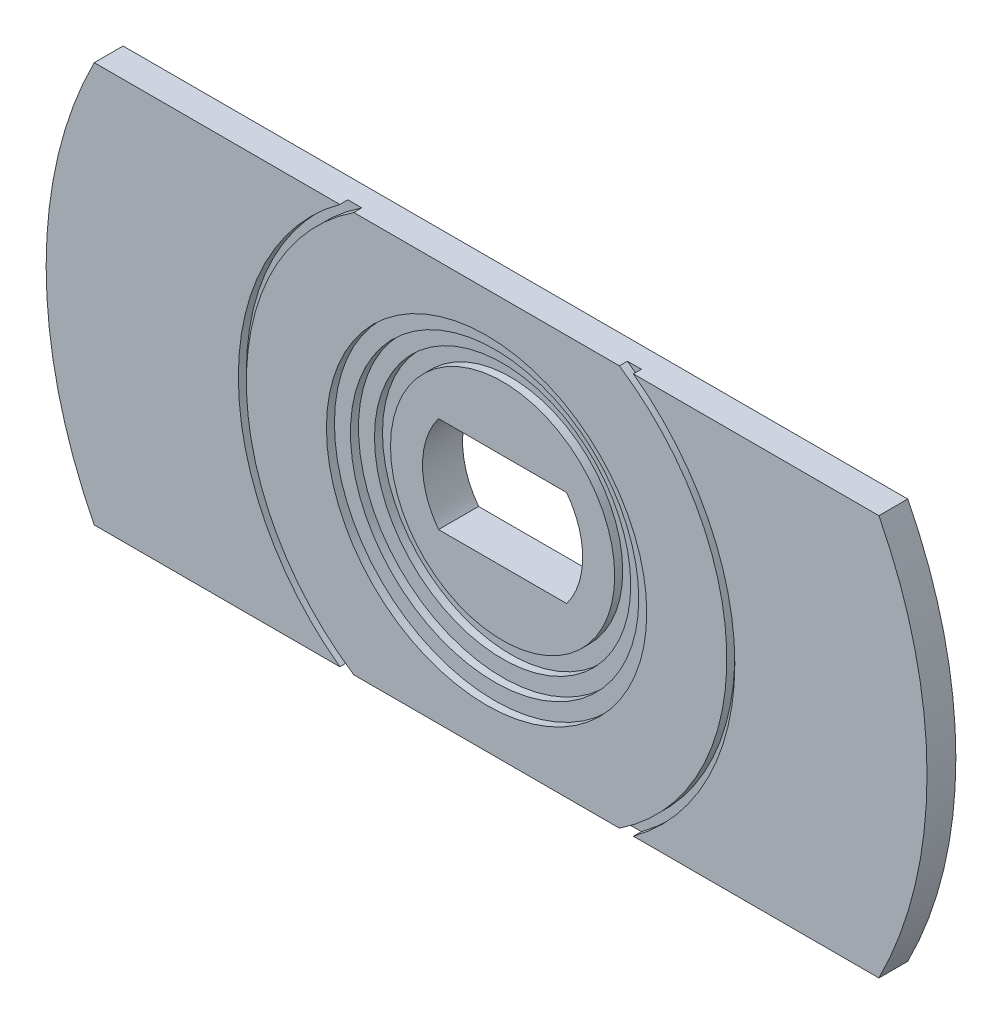
ISO-10303-21;
HEADER;
FILE_DESCRIPTION(('STEP AP214'),'2;1');
FILE_NAME('part.step','',(''),(''),'','','');
FILE_SCHEMA(('AUTOMOTIVE_DESIGN { 1 0 10303 214 1 1 1 1 }'));
ENDSEC;
DATA;
#1=APPLICATION_CONTEXT('core data for automotive mechanical design processes');
#2=APPLICATION_PROTOCOL_DEFINITION('international standard','automotive_design',2000,#1);
#3=PRODUCT_CONTEXT('',#1,'mechanical');
#4=PRODUCT('Part','Part','',(#3));
#5=PRODUCT_RELATED_PRODUCT_CATEGORY('part','',(#4));
#6=PRODUCT_DEFINITION_FORMATION('','',#4);
#7=PRODUCT_DEFINITION_CONTEXT('part definition',#1,'design');
#8=PRODUCT_DEFINITION('design','',#6,#7);
#9=PRODUCT_DEFINITION_SHAPE('','',#8);
#10=(LENGTH_UNIT() NAMED_UNIT(*) SI_UNIT(.MILLI.,.METRE.));
#11=(NAMED_UNIT(*) PLANE_ANGLE_UNIT() SI_UNIT($,.RADIAN.));
#12=(NAMED_UNIT(*) SI_UNIT($,.STERADIAN.) SOLID_ANGLE_UNIT());
#13=UNCERTAINTY_MEASURE_WITH_UNIT(LENGTH_MEASURE(1.E-05),#10,'distance_accuracy_value','');
#14=(GEOMETRIC_REPRESENTATION_CONTEXT(3) GLOBAL_UNCERTAINTY_ASSIGNED_CONTEXT((#13)) GLOBAL_UNIT_ASSIGNED_CONTEXT((#10,
#11,#12)) REPRESENTATION_CONTEXT('',''));
#15=CARTESIAN_POINT('',(0.,0.,0.));
#16=DIRECTION('',(0.,0.,1.));
#17=DIRECTION('',(1.,0.,0.));
#18=AXIS2_PLACEMENT_3D('',#15,#16,#17);
#19=CARTESIAN_POINT('',(0.,0.,1.48351648351648));
#20=DIRECTION('',(0.,0.,1.));
#21=DIRECTION('',(1.,0.,0.));
#22=AXIS2_PLACEMENT_3D('',#19,#20,#21);
#23=CYLINDRICAL_SURFACE('',#22,15.);
#24=CARTESIAN_POINT('',(0.,0.,-0.500000000000002));
#25=DIRECTION('',(0.,0.,1.));
#26=DIRECTION('',(1.,0.,0.));
#27=AXIS2_PLACEMENT_3D('',#24,#25,#26);
#28=CIRCLE('',#27,15.);
#29=CARTESIAN_POINT('',(8.2915619758885,-12.5,-0.500000000000002));
#30=VERTEX_POINT('',#29);
#31=CARTESIAN_POINT('',(8.2915619758885,12.5,-0.500000000000002));
#32=VERTEX_POINT('',#31);
#33=EDGE_CURVE('E266',#30,#32,#28,.T.);
#34=ORIENTED_EDGE('',*,*,#33,.T.);
#35=DIRECTION('',(0.,0.,1.));
#36=VECTOR('',#35,1.);
#37=CARTESIAN_POINT('',(8.2915619758885,12.5,1.48351648351648));
#38=LINE('',#37,#36);
#39=CARTESIAN_POINT('',(8.2915619758885,12.5,0.));
#40=VERTEX_POINT('',#39);
#41=EDGE_CURVE('E247',#32,#40,#38,.T.);
#42=ORIENTED_EDGE('',*,*,#41,.T.);
#43=CARTESIAN_POINT('',(0.,0.,0.));
#44=DIRECTION('',(0.,0.,1.));
#45=DIRECTION('',(1.,0.,0.));
#46=AXIS2_PLACEMENT_3D('',#43,#44,#45);
#47=CIRCLE('',#46,15.);
#48=CARTESIAN_POINT('',(8.2915619758885,-12.5,0.));
#49=VERTEX_POINT('',#48);
#50=EDGE_CURVE('E270',#49,#40,#47,.T.);
#51=ORIENTED_EDGE('',*,*,#50,.F.);
#52=DIRECTION('',(0.,0.,1.));
#53=VECTOR('',#52,1.);
#54=CARTESIAN_POINT('',(8.2915619758885,-12.5,1.48351648351648));
#55=LINE('',#54,#53);
#56=EDGE_CURVE('E224',#49,#30,#55,.F.);
#57=ORIENTED_EDGE('',*,*,#56,.T.);
#58=EDGE_LOOP('',(#34,#42,#51,#57));
#59=FACE_BOUND('',#58,.T.);
#60=ADVANCED_FACE('F35',(#59),#23,.T.);
#61=CARTESIAN_POINT('',(0.,15.,-0.500000000000002));
#62=DIRECTION('',(0.,0.,-1.));
#63=DIRECTION('',(-1.,0.,0.));
#64=AXIS2_PLACEMENT_3D('',#61,#62,#63);
#65=PLANE('',#64);
#66=CARTESIAN_POINT('',(0.,0.,-0.500000000000002));
#67=DIRECTION('',(0.,0.,1.));
#68=DIRECTION('',(1.,0.,0.));
#69=AXIS2_PLACEMENT_3D('',#66,#67,#68);
#70=CIRCLE('',#69,15.5);
#71=CARTESIAN_POINT('',(9.16515138991168,-12.5,-0.500000000000002));
#72=VERTEX_POINT('',#71);
#73=CARTESIAN_POINT('',(9.16515138991168,12.5,-0.500000000000002));
#74=VERTEX_POINT('',#73);
#75=EDGE_CURVE('E262',#72,#74,#70,.T.);
#76=ORIENTED_EDGE('',*,*,#75,.T.);
#77=DIRECTION('',(-1.,0.,0.));
#78=VECTOR('',#77,1.);
#79=CARTESIAN_POINT('',(0.,12.5,-0.500000000000002));
#80=LINE('',#79,#78);
#81=EDGE_CURVE('E241',#74,#32,#80,.T.);
#82=ORIENTED_EDGE('',*,*,#81,.T.);
#83=ORIENTED_EDGE('',*,*,#33,.F.);
#84=DIRECTION('',(1.,0.,0.));
#85=VECTOR('',#84,1.);
#86=CARTESIAN_POINT('',(0.,-12.5,-0.500000000000002));
#87=LINE('',#86,#85);
#88=EDGE_CURVE('E221',#30,#72,#87,.T.);
#89=ORIENTED_EDGE('',*,*,#88,.T.);
#90=EDGE_LOOP('',(#76,#82,#83,#89));
#91=FACE_BOUND('',#90,.T.);
#92=ADVANCED_FACE('F336',(#91),#65,.F.);
#93=CARTESIAN_POINT('',(0.,0.,1.48351648351648));
#94=DIRECTION('',(0.,0.,1.));
#95=DIRECTION('',(1.,0.,0.));
#96=AXIS2_PLACEMENT_3D('',#93,#94,#95);
#97=CYLINDRICAL_SURFACE('',#96,15.5);
#98=CARTESIAN_POINT('',(0.,0.,0.));
#99=DIRECTION('',(0.,0.,1.));
#100=DIRECTION('',(1.,0.,0.));
#101=AXIS2_PLACEMENT_3D('',#98,#99,#100);
#102=CIRCLE('',#101,15.5);
#103=CARTESIAN_POINT('',(9.16515138991165,-12.5,0.));
#104=VERTEX_POINT('',#103);
#105=CARTESIAN_POINT('',(9.16515138991166,12.5,0.));
#106=VERTEX_POINT('',#105);
#107=EDGE_CURVE('E258',#104,#106,#102,.T.);
#108=ORIENTED_EDGE('',*,*,#107,.T.);
#109=DIRECTION('',(0.,0.,1.));
#110=VECTOR('',#109,1.);
#111=CARTESIAN_POINT('',(9.16515138991168,12.5,1.48351648351648));
#112=LINE('',#111,#110);
#113=EDGE_CURVE('E244',#106,#74,#112,.F.);
#114=ORIENTED_EDGE('',*,*,#113,.T.);
#115=ORIENTED_EDGE('',*,*,#75,.F.);
#116=DIRECTION('',(0.,0.,1.));
#117=VECTOR('',#116,1.);
#118=CARTESIAN_POINT('',(9.16515138991168,-12.5,1.48351648351648));
#119=LINE('',#118,#117);
#120=EDGE_CURVE('E210',#72,#104,#119,.T.);
#121=ORIENTED_EDGE('',*,*,#120,.T.);
#122=EDGE_LOOP('',(#108,#114,#115,#121));
#123=FACE_BOUND('',#122,.T.);
#124=ADVANCED_FACE('F339',(#123),#97,.F.);
#125=CARTESIAN_POINT('',(0.,27.5,0.));
#126=DIRECTION('',(0.,0.,-1.));
#127=DIRECTION('',(-1.,0.,0.));
#128=AXIS2_PLACEMENT_3D('',#125,#126,#127);
#129=PLANE('',#128);
#130=CARTESIAN_POINT('',(0.,0.,0.));
#131=DIRECTION('',(0.,0.,1.));
#132=DIRECTION('',(1.,0.,0.));
#133=AXIS2_PLACEMENT_3D('',#130,#131,#132);
#134=CIRCLE('',#133,27.5);
#135=CARTESIAN_POINT('',(24.4948974278318,-12.5,0.));
#136=VERTEX_POINT('',#135);
#137=CARTESIAN_POINT('',(24.4948974278318,12.5,0.));
#138=VERTEX_POINT('',#137);
#139=EDGE_CURVE('E254',#136,#138,#134,.T.);
#140=ORIENTED_EDGE('',*,*,#139,.T.);
#141=DIRECTION('',(1.,0.,0.));
#142=VECTOR('',#141,1.);
#143=CARTESIAN_POINT('',(-24.4948974278318,12.5,0.));
#144=LINE('',#143,#142);
#145=EDGE_CURVE('E205',#106,#138,#144,.T.);
#146=ORIENTED_EDGE('',*,*,#145,.F.);
#147=ORIENTED_EDGE('',*,*,#107,.F.);
#148=DIRECTION('',(-1.,0.,0.));
#149=VECTOR('',#148,1.);
#150=CARTESIAN_POINT('',(-24.4948974278318,-12.5,0.));
#151=LINE('',#150,#149);
#152=EDGE_CURVE('E211',#136,#104,#151,.T.);
#153=ORIENTED_EDGE('',*,*,#152,.F.);
#154=EDGE_LOOP('',(#140,#146,#147,#153));
#155=FACE_BOUND('',#154,.T.);
#156=ADVANCED_FACE('F343',(#155),#129,.F.);
#157=CARTESIAN_POINT('',(0.,0.,1.48351648351648));
#158=DIRECTION('',(0.,0.,1.));
#159=DIRECTION('',(1.,0.,0.));
#160=AXIS2_PLACEMENT_3D('',#157,#158,#159);
#161=CYLINDRICAL_SURFACE('',#160,27.5);
#162=CARTESIAN_POINT('',(0.,0.,-1.8));
#163=DIRECTION('',(0.,0.,1.));
#164=DIRECTION('',(1.,0.,0.));
#165=AXIS2_PLACEMENT_3D('',#162,#163,#164);
#166=CIRCLE('',#165,27.5);
#167=CARTESIAN_POINT('',(24.4948974278318,-12.5,-1.8));
#168=VERTEX_POINT('',#167);
#169=CARTESIAN_POINT('',(24.4948974278318,12.5,-1.8));
#170=VERTEX_POINT('',#169);
#171=EDGE_CURVE('E250',#168,#170,#166,.T.);
#172=ORIENTED_EDGE('',*,*,#171,.T.);
#173=DIRECTION('',(0.,0.,1.));
#174=VECTOR('',#173,1.);
#175=CARTESIAN_POINT('',(24.4948974278318,12.5,-53.034753829798));
#176=LINE('',#175,#174);
#177=EDGE_CURVE('E58',#170,#138,#176,.T.);
#178=ORIENTED_EDGE('',*,*,#177,.T.);
#179=ORIENTED_EDGE('',*,*,#139,.F.);
#180=DIRECTION('',(0.,0.,1.));
#181=VECTOR('',#180,1.);
#182=CARTESIAN_POINT('',(24.4948974278318,-12.5,-53.034753829798));
#183=LINE('',#182,#181);
#184=EDGE_CURVE('E213',#168,#136,#183,.T.);
#185=ORIENTED_EDGE('',*,*,#184,.F.);
#186=EDGE_LOOP('',(#172,#178,#179,#185));
#187=FACE_BOUND('',#186,.T.);
#188=ADVANCED_FACE('F348',(#187),#161,.T.);
#189=CARTESIAN_POINT('',(0.,7.,-1.5));
#190=DIRECTION('',(0.,0.,-1.));
#191=DIRECTION('',(-1.,0.,0.));
#192=AXIS2_PLACEMENT_3D('',#189,#190,#191);
#193=PLANE('',#192);
#194=CARTESIAN_POINT('',(0.,0.,-1.5));
#195=DIRECTION('',(0.,0.,1.));
#196=DIRECTION('',(1.,0.,0.));
#197=AXIS2_PLACEMENT_3D('',#194,#195,#196);
#198=CIRCLE('',#197,7.);
#199=CARTESIAN_POINT('',(7.,0.,-1.5));
#200=VERTEX_POINT('',#199);
#201=EDGE_CURVE('E11',#200,#200,#198,.T.);
#202=ORIENTED_EDGE('',*,*,#201,.F.);
#203=EDGE_LOOP('',(#202));
#204=FACE_BOUND('',#203,.T.);
#205=CARTESIAN_POINT('',(0.,0.,-1.5));
#206=DIRECTION('',(0.,0.,1.));
#207=DIRECTION('',(1.,0.,0.));
#208=AXIS2_PLACEMENT_3D('',#205,#206,#207);
#209=CIRCLE('',#208,8.);
#210=CARTESIAN_POINT('',(8.,0.,-1.5));
#211=VERTEX_POINT('',#210);
#212=EDGE_CURVE('E43',#211,#211,#209,.T.);
#213=ORIENTED_EDGE('',*,*,#212,.T.);
#214=EDGE_LOOP('',(#213));
#215=FACE_BOUND('',#214,.T.);
#216=ADVANCED_FACE('F37',(#204,#215),#193,.F.);
#217=CARTESIAN_POINT('',(0.,0.,1.48351648351648));
#218=DIRECTION('',(0.,0.,1.));
#219=DIRECTION('',(1.,0.,0.));
#220=AXIS2_PLACEMENT_3D('',#217,#218,#219);
#221=CYLINDRICAL_SURFACE('',#220,8.);
#222=ORIENTED_EDGE('',*,*,#212,.F.);
#223=EDGE_LOOP('',(#222));
#224=FACE_BOUND('',#223,.T.);
#225=CARTESIAN_POINT('',(0.,0.,-1.));
#226=DIRECTION('',(0.,0.,1.));
#227=DIRECTION('',(1.,0.,0.));
#228=AXIS2_PLACEMENT_3D('',#225,#226,#227);
#229=CIRCLE('',#228,8.);
#230=CARTESIAN_POINT('',(8.,0.,-1.));
#231=VERTEX_POINT('',#230);
#232=EDGE_CURVE('E286',#231,#231,#229,.T.);
#233=ORIENTED_EDGE('',*,*,#232,.T.);
#234=EDGE_LOOP('',(#233));
#235=FACE_BOUND('',#234,.T.);
#236=ADVANCED_FACE('F292',(#224,#235),#221,.F.);
#237=CARTESIAN_POINT('',(0.,8.,-1.));
#238=DIRECTION('',(0.,0.,-1.));
#239=DIRECTION('',(-1.,0.,0.));
#240=AXIS2_PLACEMENT_3D('',#237,#238,#239);
#241=PLANE('',#240);
#242=ORIENTED_EDGE('',*,*,#232,.F.);
#243=EDGE_LOOP('',(#242));
#244=FACE_BOUND('',#243,.T.);
#245=CARTESIAN_POINT('',(0.,0.,-1.));
#246=DIRECTION('',(0.,0.,1.));
#247=DIRECTION('',(1.,0.,0.));
#248=AXIS2_PLACEMENT_3D('',#245,#246,#247);
#249=CIRCLE('',#248,9.);
#250=CARTESIAN_POINT('',(9.,0.,-1.));
#251=VERTEX_POINT('',#250);
#252=EDGE_CURVE('E283',#251,#251,#249,.T.);
#253=ORIENTED_EDGE('',*,*,#252,.T.);
#254=EDGE_LOOP('',(#253));
#255=FACE_BOUND('',#254,.T.);
#256=ADVANCED_FACE('F295',(#244,#255),#241,.F.);
#257=CARTESIAN_POINT('',(0.,0.,1.48351648351648));
#258=DIRECTION('',(0.,0.,1.));
#259=DIRECTION('',(1.,0.,0.));
#260=AXIS2_PLACEMENT_3D('',#257,#258,#259);
#261=CYLINDRICAL_SURFACE('',#260,9.);
#262=ORIENTED_EDGE('',*,*,#252,.F.);
#263=EDGE_LOOP('',(#262));
#264=FACE_BOUND('',#263,.T.);
#265=CARTESIAN_POINT('',(0.,0.,-0.500000000000003));
#266=DIRECTION('',(0.,0.,1.));
#267=DIRECTION('',(1.,0.,0.));
#268=AXIS2_PLACEMENT_3D('',#265,#266,#267);
#269=CIRCLE('',#268,9.);
#270=CARTESIAN_POINT('',(9.,0.,-0.500000000000003));
#271=VERTEX_POINT('',#270);
#272=EDGE_CURVE('E280',#271,#271,#269,.T.);
#273=ORIENTED_EDGE('',*,*,#272,.T.);
#274=EDGE_LOOP('',(#273));
#275=FACE_BOUND('',#274,.T.);
#276=ADVANCED_FACE('F300',(#264,#275),#261,.F.);
#277=CARTESIAN_POINT('',(0.,9.,-0.500000000000003));
#278=DIRECTION('',(0.,0.,-1.));
#279=DIRECTION('',(-1.,0.,0.));
#280=AXIS2_PLACEMENT_3D('',#277,#278,#279);
#281=PLANE('',#280);
#282=ORIENTED_EDGE('',*,*,#272,.F.);
#283=EDGE_LOOP('',(#282));
#284=FACE_BOUND('',#283,.T.);
#285=CARTESIAN_POINT('',(0.,0.,-0.500000000000003));
#286=DIRECTION('',(0.,0.,1.));
#287=DIRECTION('',(1.,0.,0.));
#288=AXIS2_PLACEMENT_3D('',#285,#286,#287);
#289=CIRCLE('',#288,10.);
#290=CARTESIAN_POINT('',(10.,0.,-0.500000000000003));
#291=VERTEX_POINT('',#290);
#292=EDGE_CURVE('E277',#291,#291,#289,.T.);
#293=ORIENTED_EDGE('',*,*,#292,.T.);
#294=EDGE_LOOP('',(#293));
#295=FACE_BOUND('',#294,.T.);
#296=ADVANCED_FACE('F306',(#284,#295),#281,.F.);
#297=CARTESIAN_POINT('',(0.,0.,1.48351648351648));
#298=DIRECTION('',(0.,0.,1.));
#299=DIRECTION('',(1.,0.,0.));
#300=AXIS2_PLACEMENT_3D('',#297,#298,#299);
#301=CYLINDRICAL_SURFACE('',#300,10.);
#302=ORIENTED_EDGE('',*,*,#292,.F.);
#303=EDGE_LOOP('',(#302));
#304=FACE_BOUND('',#303,.T.);
#305=CARTESIAN_POINT('',(0.,0.,0.));
#306=DIRECTION('',(0.,0.,1.));
#307=DIRECTION('',(1.,0.,0.));
#308=AXIS2_PLACEMENT_3D('',#305,#306,#307);
#309=CIRCLE('',#308,10.);
#310=CARTESIAN_POINT('',(10.,0.,0.));
#311=VERTEX_POINT('',#310);
#312=EDGE_CURVE('E274',#311,#311,#309,.T.);
#313=ORIENTED_EDGE('',*,*,#312,.T.);
#314=EDGE_LOOP('',(#313));
#315=FACE_BOUND('',#314,.T.);
#316=ADVANCED_FACE('F312',(#304,#315),#301,.F.);
#317=CARTESIAN_POINT('',(0.,15.,0.));
#318=DIRECTION('',(0.,0.,-1.));
#319=DIRECTION('',(-1.,0.,0.));
#320=AXIS2_PLACEMENT_3D('',#317,#318,#319);
#321=PLANE('',#320);
#322=ORIENTED_EDGE('',*,*,#312,.F.);
#323=EDGE_LOOP('',(#322));
#324=FACE_BOUND('',#323,.T.);
#325=ORIENTED_EDGE('',*,*,#50,.T.);
#326=CARTESIAN_POINT('',(-8.2915619758885,12.5,0.));
#327=VERTEX_POINT('',#326);
#328=EDGE_CURVE('E204',#327,#40,#144,.T.);
#329=ORIENTED_EDGE('',*,*,#328,.F.);
#330=CARTESIAN_POINT('',(-8.2915619758885,-12.5,0.));
#331=VERTEX_POINT('',#330);
#332=EDGE_CURVE('E273',#327,#331,#47,.T.);
#333=ORIENTED_EDGE('',*,*,#332,.T.);
#334=EDGE_CURVE('E214',#49,#331,#151,.T.);
#335=ORIENTED_EDGE('',*,*,#334,.F.);
#336=EDGE_LOOP('',(#325,#329,#333,#335));
#337=FACE_BOUND('',#336,.T.);
#338=ADVANCED_FACE('F318',(#324,#337),#321,.F.);
#339=ORIENTED_EDGE('',*,*,#332,.F.);
#340=DIRECTION('',(0.,0.,1.));
#341=VECTOR('',#340,1.);
#342=CARTESIAN_POINT('',(-8.2915619758885,12.5,1.48351648351648));
#343=LINE('',#342,#341);
#344=CARTESIAN_POINT('',(-8.2915619758885,12.5,-0.500000000000002));
#345=VERTEX_POINT('',#344);
#346=EDGE_CURVE('E240',#327,#345,#343,.F.);
#347=ORIENTED_EDGE('',*,*,#346,.T.);
#348=CARTESIAN_POINT('',(-8.2915619758885,-12.5,-0.500000000000002));
#349=VERTEX_POINT('',#348);
#350=EDGE_CURVE('E269',#345,#349,#28,.T.);
#351=ORIENTED_EDGE('',*,*,#350,.T.);
#352=DIRECTION('',(0.,0.,1.));
#353=VECTOR('',#352,1.);
#354=CARTESIAN_POINT('',(-8.2915619758885,-12.5,1.48351648351648));
#355=LINE('',#354,#353);
#356=EDGE_CURVE('E231',#349,#331,#355,.T.);
#357=ORIENTED_EDGE('',*,*,#356,.T.);
#358=EDGE_LOOP('',(#339,#347,#351,#357));
#359=FACE_BOUND('',#358,.T.);
#360=ADVANCED_FACE('F324',(#359),#23,.T.);
#361=ORIENTED_EDGE('',*,*,#350,.F.);
#362=CARTESIAN_POINT('',(-9.16515138991168,12.5,-0.500000000000002));
#363=VERTEX_POINT('',#362);
#364=EDGE_CURVE('E237',#345,#363,#80,.T.);
#365=ORIENTED_EDGE('',*,*,#364,.T.);
#366=CARTESIAN_POINT('',(-9.16515138991168,-12.5,-0.500000000000002));
#367=VERTEX_POINT('',#366);
#368=EDGE_CURVE('E265',#363,#367,#70,.T.);
#369=ORIENTED_EDGE('',*,*,#368,.T.);
#370=EDGE_CURVE('E225',#367,#349,#87,.T.);
#371=ORIENTED_EDGE('',*,*,#370,.T.);
#372=EDGE_LOOP('',(#361,#365,#369,#371));
#373=FACE_BOUND('',#372,.T.);
#374=ADVANCED_FACE('F373',(#373),#65,.F.);
#375=ORIENTED_EDGE('',*,*,#368,.F.);
#376=DIRECTION('',(0.,0.,1.));
#377=VECTOR('',#376,1.);
#378=CARTESIAN_POINT('',(-9.16515138991168,12.5,1.48351648351648));
#379=LINE('',#378,#377);
#380=CARTESIAN_POINT('',(-9.16515138991168,12.5,0.));
#381=VERTEX_POINT('',#380);
#382=EDGE_CURVE('E234',#363,#381,#379,.T.);
#383=ORIENTED_EDGE('',*,*,#382,.T.);
#384=CARTESIAN_POINT('',(-9.16515138991168,-12.5,0.));
#385=VERTEX_POINT('',#384);
#386=EDGE_CURVE('E261',#381,#385,#102,.T.);
#387=ORIENTED_EDGE('',*,*,#386,.T.);
#388=DIRECTION('',(0.,0.,1.));
#389=VECTOR('',#388,1.);
#390=CARTESIAN_POINT('',(-9.16515138991168,-12.5,1.48351648351648));
#391=LINE('',#390,#389);
#392=EDGE_CURVE('E228',#385,#367,#391,.F.);
#393=ORIENTED_EDGE('',*,*,#392,.T.);
#394=EDGE_LOOP('',(#375,#383,#387,#393));
#395=FACE_BOUND('',#394,.T.);
#396=ADVANCED_FACE('F368',(#395),#97,.F.);
#397=ORIENTED_EDGE('',*,*,#386,.F.);
#398=CARTESIAN_POINT('',(-24.4948974278318,12.5,0.));
#399=VERTEX_POINT('',#398);
#400=EDGE_CURVE('E201',#399,#381,#144,.T.);
#401=ORIENTED_EDGE('',*,*,#400,.F.);
#402=CARTESIAN_POINT('',(-24.4948974278318,-12.5,0.));
#403=VERTEX_POINT('',#402);
#404=EDGE_CURVE('E257',#399,#403,#134,.T.);
#405=ORIENTED_EDGE('',*,*,#404,.T.);
#406=EDGE_CURVE('E200',#385,#403,#151,.T.);
#407=ORIENTED_EDGE('',*,*,#406,.F.);
#408=EDGE_LOOP('',(#397,#401,#405,#407));
#409=FACE_BOUND('',#408,.T.);
#410=ADVANCED_FACE('F364',(#409),#129,.F.);
#411=ORIENTED_EDGE('',*,*,#404,.F.);
#412=DIRECTION('',(0.,0.,1.));
#413=VECTOR('',#412,1.);
#414=CARTESIAN_POINT('',(-24.4948974278318,12.5,-53.034753829798));
#415=LINE('',#414,#413);
#416=CARTESIAN_POINT('',(-24.4948974278318,12.5,-1.8));
#417=VERTEX_POINT('',#416);
#418=EDGE_CURVE('E203',#417,#399,#415,.T.);
#419=ORIENTED_EDGE('',*,*,#418,.F.);
#420=CARTESIAN_POINT('',(-24.4948974278318,-12.5,-1.8));
#421=VERTEX_POINT('',#420);
#422=EDGE_CURVE('E253',#417,#421,#166,.T.);
#423=ORIENTED_EDGE('',*,*,#422,.T.);
#424=DIRECTION('',(0.,0.,1.));
#425=VECTOR('',#424,1.);
#426=CARTESIAN_POINT('',(-24.4948974278318,-12.5,-53.034753829798));
#427=LINE('',#426,#425);
#428=EDGE_CURVE('E50',#421,#403,#427,.T.);
#429=ORIENTED_EDGE('',*,*,#428,.T.);
#430=EDGE_LOOP('',(#411,#419,#423,#429));
#431=FACE_BOUND('',#430,.T.);
#432=ADVANCED_FACE('F359',(#431),#161,.T.);
#433=CARTESIAN_POINT('',(0.,27.5,-1.8));
#434=DIRECTION('',(0.,0.,1.));
#435=DIRECTION('',(1.,0.,0.));
#436=AXIS2_PLACEMENT_3D('',#433,#434,#435);
#437=PLANE('',#436);
#438=ORIENTED_EDGE('',*,*,#422,.F.);
#439=DIRECTION('',(-1.,0.,0.));
#440=VECTOR('',#439,1.);
#441=CARTESIAN_POINT('',(-24.4948974278318,12.5,-1.8));
#442=LINE('',#441,#440);
#443=EDGE_CURVE('E207',#170,#417,#442,.T.);
#444=ORIENTED_EDGE('',*,*,#443,.F.);
#445=ORIENTED_EDGE('',*,*,#171,.F.);
#446=DIRECTION('',(1.,0.,0.));
#447=VECTOR('',#446,1.);
#448=CARTESIAN_POINT('',(-24.4948974278318,-12.5,-1.8));
#449=LINE('',#448,#447);
#450=EDGE_CURVE('E216',#421,#168,#449,.T.);
#451=ORIENTED_EDGE('',*,*,#450,.F.);
#452=EDGE_LOOP('',(#438,#444,#445,#451));
#453=FACE_BOUND('',#452,.T.);
#454=CARTESIAN_POINT('',(0.,0.,-1.8));
#455=DIRECTION('',(0.,0.,1.));
#456=DIRECTION('',(1.,0.,0.));
#457=AXIS2_PLACEMENT_3D('',#454,#455,#456);
#458=CIRCLE('',#457,7.);
#459=CARTESIAN_POINT('',(7.,0.,-1.8));
#460=VERTEX_POINT('',#459);
#461=EDGE_CURVE('E197',#460,#460,#458,.F.);
#462=ORIENTED_EDGE('',*,*,#461,.F.);
#463=EDGE_LOOP('',(#462));
#464=FACE_BOUND('',#463,.T.);
#465=ADVANCED_FACE('F352',(#453,#464),#437,.F.);
#466=CARTESIAN_POINT('',(-24.4948974278318,-12.5,-53.034753829798));
#467=DIRECTION('',(0.,1.,0.));
#468=DIRECTION('',(0.,0.,1.));
#469=AXIS2_PLACEMENT_3D('',#466,#467,#468);
#470=PLANE('',#469);
#471=ORIENTED_EDGE('',*,*,#370,.F.);
#472=ORIENTED_EDGE('',*,*,#392,.F.);
#473=ORIENTED_EDGE('',*,*,#406,.T.);
#474=ORIENTED_EDGE('',*,*,#428,.F.);
#475=ORIENTED_EDGE('',*,*,#450,.T.);
#476=ORIENTED_EDGE('',*,*,#184,.T.);
#477=ORIENTED_EDGE('',*,*,#152,.T.);
#478=ORIENTED_EDGE('',*,*,#120,.F.);
#479=ORIENTED_EDGE('',*,*,#88,.F.);
#480=ORIENTED_EDGE('',*,*,#56,.F.);
#481=ORIENTED_EDGE('',*,*,#334,.T.);
#482=ORIENTED_EDGE('',*,*,#356,.F.);
#483=EDGE_LOOP('',(#471,#472,#473,#474,#475,#476,#477,#478,#479,#480,#481,#482));
#484=FACE_BOUND('',#483,.T.);
#485=ADVANCED_FACE('F376',(#484),#470,.F.);
#486=CARTESIAN_POINT('',(-24.4948974278318,12.5,-53.034753829798));
#487=DIRECTION('',(0.,-1.,0.));
#488=DIRECTION('',(0.,0.,-1.));
#489=AXIS2_PLACEMENT_3D('',#486,#487,#488);
#490=PLANE('',#489);
#491=ORIENTED_EDGE('',*,*,#81,.F.);
#492=ORIENTED_EDGE('',*,*,#113,.F.);
#493=ORIENTED_EDGE('',*,*,#145,.T.);
#494=ORIENTED_EDGE('',*,*,#177,.F.);
#495=ORIENTED_EDGE('',*,*,#443,.T.);
#496=ORIENTED_EDGE('',*,*,#418,.T.);
#497=ORIENTED_EDGE('',*,*,#400,.T.);
#498=ORIENTED_EDGE('',*,*,#382,.F.);
#499=ORIENTED_EDGE('',*,*,#364,.F.);
#500=ORIENTED_EDGE('',*,*,#346,.F.);
#501=ORIENTED_EDGE('',*,*,#328,.T.);
#502=ORIENTED_EDGE('',*,*,#41,.F.);
#503=EDGE_LOOP('',(#491,#492,#493,#494,#495,#496,#497,#498,#499,#500,#501,#502));
#504=FACE_BOUND('',#503,.T.);
#505=ADVANCED_FACE('F334',(#504),#490,.F.);
#506=CARTESIAN_POINT('',(0.,0.,-1.));
#507=DIRECTION('',(0.,0.,-1.));
#508=DIRECTION('',(-1.,0.,0.));
#509=AXIS2_PLACEMENT_3D('',#506,#507,#508);
#510=CYLINDRICAL_SURFACE('',#509,7.);
#511=CARTESIAN_POINT('',(0.,0.,-1.));
#512=DIRECTION('',(0.,0.,1.));
#513=DIRECTION('',(1.,0.,0.));
#514=AXIS2_PLACEMENT_3D('',#511,#512,#513);
#515=CIRCLE('',#514,7.);
#516=CARTESIAN_POINT('',(7.,0.,-1.));
#517=VERTEX_POINT('',#516);
#518=EDGE_CURVE('E159',#517,#517,#515,.T.);
#519=ORIENTED_EDGE('',*,*,#518,.F.);
#520=EDGE_LOOP('',(#519));
#521=FACE_BOUND('',#520,.T.);
#522=ORIENTED_EDGE('',*,*,#201,.T.);
#523=EDGE_LOOP('',(#522));
#524=FACE_BOUND('',#523,.T.);
#525=ADVANCED_FACE('F383',(#521,#524),#510,.T.);
#526=CARTESIAN_POINT('',(0.,0.,-3.5));
#527=DIRECTION('',(0.,0.,1.));
#528=DIRECTION('',(1.,0.,0.));
#529=AXIS2_PLACEMENT_3D('',#526,#527,#528);
#530=CIRCLE('',#529,7.);
#531=CARTESIAN_POINT('',(7.,0.,-3.5));
#532=VERTEX_POINT('',#531);
#533=EDGE_CURVE('E179',#532,#532,#530,.T.);
#534=ORIENTED_EDGE('',*,*,#533,.T.);
#535=EDGE_LOOP('',(#534));
#536=FACE_BOUND('',#535,.T.);
#537=ORIENTED_EDGE('',*,*,#461,.T.);
#538=EDGE_LOOP('',(#537));
#539=FACE_BOUND('',#538,.T.);
#540=ADVANCED_FACE('F518',(#536,#539),#510,.T.);
#541=CARTESIAN_POINT('',(0.,0.,-1.));
#542=DIRECTION('',(0.,0.,1.));
#543=DIRECTION('',(1.,0.,0.));
#544=AXIS2_PLACEMENT_3D('',#541,#542,#543);
#545=PLANE('',#544);
#546=ORIENTED_EDGE('',*,*,#518,.T.);
#547=EDGE_LOOP('',(#546));
#548=FACE_BOUND('',#547,.T.);
#549=DIRECTION('',(-1.,0.,0.));
#550=VECTOR('',#549,1.);
#551=CARTESIAN_POINT('',(4.,3.,-1.));
#552=LINE('',#551,#550);
#553=CARTESIAN_POINT('',(4.,3.,-1.));
#554=VERTEX_POINT('',#553);
#555=CARTESIAN_POINT('',(-4.,3.,-1.));
#556=VERTEX_POINT('',#555);
#557=EDGE_CURVE('E183',#554,#556,#552,.T.);
#558=ORIENTED_EDGE('',*,*,#557,.F.);
#559=CARTESIAN_POINT('',(0.,0.,-1.));
#560=DIRECTION('',(0.,0.,1.));
#561=DIRECTION('',(1.,0.,0.));
#562=AXIS2_PLACEMENT_3D('',#559,#560,#561);
#563=CIRCLE('',#562,5.);
#564=CARTESIAN_POINT('',(4.,-3.,-1.));
#565=VERTEX_POINT('',#564);
#566=EDGE_CURVE('E156',#565,#554,#563,.T.);
#567=ORIENTED_EDGE('',*,*,#566,.F.);
#568=DIRECTION('',(1.,0.,0.));
#569=VECTOR('',#568,1.);
#570=CARTESIAN_POINT('',(4.,-3.,-1.));
#571=LINE('',#570,#569);
#572=CARTESIAN_POINT('',(-4.,-3.,-1.));
#573=VERTEX_POINT('',#572);
#574=EDGE_CURVE('E188',#573,#565,#571,.T.);
#575=ORIENTED_EDGE('',*,*,#574,.F.);
#576=CARTESIAN_POINT('',(0.,0.,-1.));
#577=DIRECTION('',(0.,0.,1.));
#578=DIRECTION('',(1.,0.,0.));
#579=AXIS2_PLACEMENT_3D('',#576,#577,#578);
#580=CIRCLE('',#579,5.);
#581=EDGE_CURVE('E185',#556,#573,#580,.T.);
#582=ORIENTED_EDGE('',*,*,#581,.F.);
#583=EDGE_LOOP('',(#558,#567,#575,#582));
#584=FACE_BOUND('',#583,.T.);
#585=ADVANCED_FACE('F528',(#548,#584),#545,.T.);
#586=CARTESIAN_POINT('',(0.,0.,-1.));
#587=DIRECTION('',(0.,0.,-1.));
#588=DIRECTION('',(-1.,0.,0.));
#589=AXIS2_PLACEMENT_3D('',#586,#587,#588);
#590=CYLINDRICAL_SURFACE('',#589,5.);
#591=DIRECTION('',(0.,0.,-1.));
#592=VECTOR('',#591,1.);
#593=CARTESIAN_POINT('',(4.,3.,-1.));
#594=LINE('',#593,#592);
#595=CARTESIAN_POINT('',(4.,3.,-3.5));
#596=VERTEX_POINT('',#595);
#597=EDGE_CURVE('E148',#554,#596,#594,.T.);
#598=ORIENTED_EDGE('',*,*,#597,.T.);
#599=CARTESIAN_POINT('',(0.,0.,-3.5));
#600=DIRECTION('',(0.,0.,1.));
#601=DIRECTION('',(1.,0.,0.));
#602=AXIS2_PLACEMENT_3D('',#599,#600,#601);
#603=CIRCLE('',#602,5.);
#604=CARTESIAN_POINT('',(4.,-3.,-3.5));
#605=VERTEX_POINT('',#604);
#606=EDGE_CURVE('E153',#605,#596,#603,.T.);
#607=ORIENTED_EDGE('',*,*,#606,.F.);
#608=DIRECTION('',(0.,0.,-1.));
#609=VECTOR('',#608,1.);
#610=CARTESIAN_POINT('',(4.,-3.,-1.));
#611=LINE('',#610,#609);
#612=EDGE_CURVE('E190',#565,#605,#611,.T.);
#613=ORIENTED_EDGE('',*,*,#612,.F.);
#614=ORIENTED_EDGE('',*,*,#566,.T.);
#615=EDGE_LOOP('',(#598,#607,#613,#614));
#616=FACE_BOUND('',#615,.T.);
#617=ADVANCED_FACE('F150',(#616),#590,.F.);
#618=CARTESIAN_POINT('',(4.,3.,-1.));
#619=DIRECTION('',(0.,-1.,0.));
#620=DIRECTION('',(0.,0.,-1.));
#621=AXIS2_PLACEMENT_3D('',#618,#619,#620);
#622=PLANE('',#621);
#623=DIRECTION('',(0.,0.,-1.));
#624=VECTOR('',#623,1.);
#625=CARTESIAN_POINT('',(-4.,3.,-1.));
#626=LINE('',#625,#624);
#627=CARTESIAN_POINT('',(-4.,3.,-3.5));
#628=VERTEX_POINT('',#627);
#629=EDGE_CURVE('E160',#556,#628,#626,.T.);
#630=ORIENTED_EDGE('',*,*,#629,.T.);
#631=DIRECTION('',(-1.,0.,0.));
#632=VECTOR('',#631,1.);
#633=CARTESIAN_POINT('',(4.,3.,-3.5));
#634=LINE('',#633,#632);
#635=EDGE_CURVE('E163',#596,#628,#634,.T.);
#636=ORIENTED_EDGE('',*,*,#635,.F.);
#637=ORIENTED_EDGE('',*,*,#597,.F.);
#638=ORIENTED_EDGE('',*,*,#557,.T.);
#639=EDGE_LOOP('',(#630,#636,#637,#638));
#640=FACE_BOUND('',#639,.T.);
#641=ADVANCED_FACE('F164',(#640),#622,.T.);
#642=CARTESIAN_POINT('',(0.,0.,-1.));
#643=DIRECTION('',(0.,0.,-1.));
#644=DIRECTION('',(-1.,0.,0.));
#645=AXIS2_PLACEMENT_3D('',#642,#643,#644);
#646=CYLINDRICAL_SURFACE('',#645,5.);
#647=DIRECTION('',(0.,0.,-1.));
#648=VECTOR('',#647,1.);
#649=CARTESIAN_POINT('',(-4.,-3.,-1.));
#650=LINE('',#649,#648);
#651=CARTESIAN_POINT('',(-4.,-3.,-3.5));
#652=VERTEX_POINT('',#651);
#653=EDGE_CURVE('E192',#573,#652,#650,.T.);
#654=ORIENTED_EDGE('',*,*,#653,.T.);
#655=CARTESIAN_POINT('',(0.,0.,-3.5));
#656=DIRECTION('',(0.,0.,1.));
#657=DIRECTION('',(1.,0.,0.));
#658=AXIS2_PLACEMENT_3D('',#655,#656,#657);
#659=CIRCLE('',#658,5.);
#660=EDGE_CURVE('E169',#628,#652,#659,.T.);
#661=ORIENTED_EDGE('',*,*,#660,.F.);
#662=ORIENTED_EDGE('',*,*,#629,.F.);
#663=ORIENTED_EDGE('',*,*,#581,.T.);
#664=EDGE_LOOP('',(#654,#661,#662,#663));
#665=FACE_BOUND('',#664,.T.);
#666=ADVANCED_FACE('F554',(#665),#646,.F.);
#667=CARTESIAN_POINT('',(4.,-3.,-1.));
#668=DIRECTION('',(0.,1.,0.));
#669=DIRECTION('',(0.,0.,1.));
#670=AXIS2_PLACEMENT_3D('',#667,#668,#669);
#671=PLANE('',#670);
#672=ORIENTED_EDGE('',*,*,#612,.T.);
#673=DIRECTION('',(1.,0.,0.));
#674=VECTOR('',#673,1.);
#675=CARTESIAN_POINT('',(4.,-3.,-3.5));
#676=LINE('',#675,#674);
#677=EDGE_CURVE('E174',#652,#605,#676,.T.);
#678=ORIENTED_EDGE('',*,*,#677,.F.);
#679=ORIENTED_EDGE('',*,*,#653,.F.);
#680=ORIENTED_EDGE('',*,*,#574,.T.);
#681=EDGE_LOOP('',(#672,#678,#679,#680));
#682=FACE_BOUND('',#681,.T.);
#683=ADVANCED_FACE('F563',(#682),#671,.T.);
#684=CARTESIAN_POINT('',(0.,0.,-3.5));
#685=DIRECTION('',(0.,0.,1.));
#686=DIRECTION('',(1.,0.,0.));
#687=AXIS2_PLACEMENT_3D('',#684,#685,#686);
#688=PLANE('',#687);
#689=ORIENTED_EDGE('',*,*,#677,.T.);
#690=ORIENTED_EDGE('',*,*,#606,.T.);
#691=ORIENTED_EDGE('',*,*,#635,.T.);
#692=ORIENTED_EDGE('',*,*,#660,.T.);
#693=EDGE_LOOP('',(#689,#690,#691,#692));
#694=FACE_BOUND('',#693,.T.);
#695=ORIENTED_EDGE('',*,*,#533,.F.);
#696=EDGE_LOOP('',(#695));
#697=FACE_BOUND('',#696,.T.);
#698=ADVANCED_FACE('F171',(#694,#697),#688,.F.);
#699=CLOSED_SHELL('',(#60,#92,#124,#156,#188,#216,#236,#256,#276,#296,#316,#338,#360,#374,#396,
#410,#432,#465,#485,#505,#525,#540,#585,#617,#641,#666,#683,#698));
#700=MANIFOLD_SOLID_BREP('B2',#699);
#701=ADVANCED_BREP_SHAPE_REPRESENTATION('',(#18,#700),#14);
#702=SHAPE_DEFINITION_REPRESENTATION(#9,#701);
ENDSEC;
END-ISO-10303-21;
